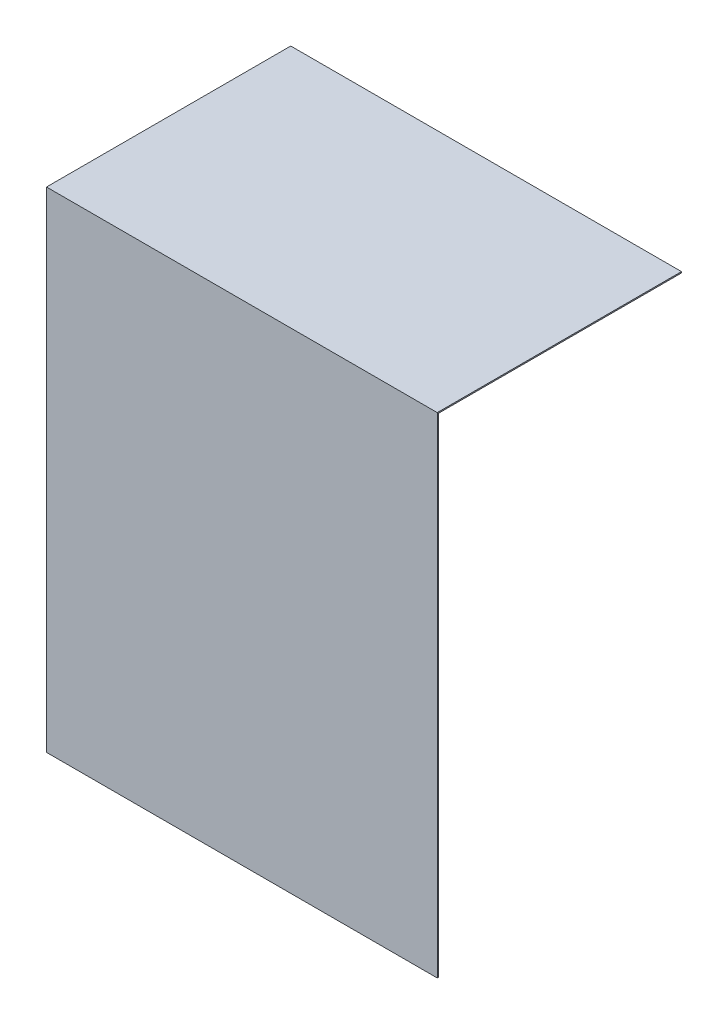
ISO-10303-21;
HEADER;
FILE_DESCRIPTION(('STEP AP214'),'2;1');
FILE_NAME('part.step','',(''),(''),'','','');
FILE_SCHEMA(('AUTOMOTIVE_DESIGN { 1 0 10303 214 1 1 1 1 }'));
ENDSEC;
DATA;
#1=APPLICATION_CONTEXT('core data for automotive mechanical design processes');
#2=APPLICATION_PROTOCOL_DEFINITION('international standard','automotive_design',2000,#1);
#3=PRODUCT_CONTEXT('',#1,'mechanical');
#4=PRODUCT('Part','Part','',(#3));
#5=PRODUCT_RELATED_PRODUCT_CATEGORY('part','',(#4));
#6=PRODUCT_DEFINITION_FORMATION('','',#4);
#7=PRODUCT_DEFINITION_CONTEXT('part definition',#1,'design');
#8=PRODUCT_DEFINITION('design','',#6,#7);
#9=PRODUCT_DEFINITION_SHAPE('','',#8);
#10=(LENGTH_UNIT() NAMED_UNIT(*) SI_UNIT(.MILLI.,.METRE.));
#11=(NAMED_UNIT(*) PLANE_ANGLE_UNIT() SI_UNIT($,.RADIAN.));
#12=(NAMED_UNIT(*) SI_UNIT($,.STERADIAN.) SOLID_ANGLE_UNIT());
#13=UNCERTAINTY_MEASURE_WITH_UNIT(LENGTH_MEASURE(1.E-05),#10,'distance_accuracy_value','');
#14=(GEOMETRIC_REPRESENTATION_CONTEXT(3) GLOBAL_UNCERTAINTY_ASSIGNED_CONTEXT((#13)) GLOBAL_UNIT_ASSIGNED_CONTEXT((#10,
#11,#12)) REPRESENTATION_CONTEXT('',''));
#15=CARTESIAN_POINT('',(0.,0.,0.));
#16=DIRECTION('',(0.,0.,1.));
#17=DIRECTION('',(1.,0.,0.));
#18=AXIS2_PLACEMENT_3D('',#15,#16,#17);
#19=CARTESIAN_POINT('',(23.8051990917926,5.3809677039066,-0.00109891080534995));
#20=CARTESIAN_POINT('',(23.8051990917926,5.38096770380169,0.000101089194650328));
#21=CARTESIAN_POINT('',(24.1891990917925,5.38096769932745,-0.00109891080535035));
#22=CARTESIAN_POINT('',(24.1891990917925,5.38096769922254,0.000101089194649927));
#23=(BOUNDED_SURFACE() B_SPLINE_SURFACE(1,1,((#19,#20),(#21,#22)),.UNSPECIFIED.,.F.,.F.,
.F.) B_SPLINE_SURFACE_WITH_KNOTS((2,2),(2,2),(-3.19999999999904E-05,0.000351999999999894),
(-1.10000000000016E-06,1.00000000000124E-07),
.UNSPECIFIED.) GEOMETRIC_REPRESENTATION_ITEM() RATIONAL_B_SPLINE_SURFACE(((1.,1.),(1.,1.))) REPRESENTATION_ITEM('') SURFACE());
#24=CARTESIAN_POINT('',(24.1571990917925,5.38096769961288,1.08919464983717E-06));
#25=CARTESIAN_POINT('',(23.8371990917926,5.38096770342884,1.08919465017077E-06));
#26=(BOUNDED_CURVE() B_SPLINE_CURVE(1,(#24,#25),.UNSPECIFIED.,.F.,
.F.) B_SPLINE_CURVE_WITH_KNOTS((2,2),(0.,0.000319999999999903),
.UNSPECIFIED.) CURVE() GEOMETRIC_REPRESENTATION_ITEM() RATIONAL_B_SPLINE_CURVE((1.,1.)) REPRESENTATION_ITEM(''));
#27=CARTESIAN_POINT('',(24.1571990917925,5.38096769961288,1.08919464983717E-06));
#28=VERTEX_POINT('',#27);
#29=CARTESIAN_POINT('',(23.8371990917926,5.38096770342886,1.08919465027085E-06));
#30=VERTEX_POINT('',#29);
#31=EDGE_CURVE('E76',#28,#30,#26,.T.);
#32=CARTESIAN_POINT('',(23.8371990917926,5.38096770342886,1.08919465027085E-06));
#33=CARTESIAN_POINT('',(23.8371990917926,5.38096770351628,-0.000998910805349862));
#34=(BOUNDED_CURVE() B_SPLINE_CURVE(1,(#32,#33),.UNSPECIFIED.,.F.,
.F.) B_SPLINE_CURVE_WITH_KNOTS((2,2),(0.,1.00000000000013E-06),
.UNSPECIFIED.) CURVE() GEOMETRIC_REPRESENTATION_ITEM() RATIONAL_B_SPLINE_CURVE((1.,1.)) REPRESENTATION_ITEM(''));
#35=CARTESIAN_POINT('',(23.8371990917926,5.38096770351629,-0.000998910805349862));
#36=VERTEX_POINT('',#35);
#37=EDGE_CURVE('E32',#30,#36,#34,.T.);
#38=CARTESIAN_POINT('',(24.1571990917925,5.38096769970031,-0.000998910805350296));
#39=CARTESIAN_POINT('',(23.8371990917926,5.38096770351627,-0.000998910805349962));
#40=(BOUNDED_CURVE() B_SPLINE_CURVE(1,(#38,#39),.UNSPECIFIED.,.F.,
.F.) B_SPLINE_CURVE_WITH_KNOTS((2,2),(0.,0.000319999999999903),
.UNSPECIFIED.) CURVE() GEOMETRIC_REPRESENTATION_ITEM() RATIONAL_B_SPLINE_CURVE((1.,1.)) REPRESENTATION_ITEM(''));
#41=CARTESIAN_POINT('',(24.1571990917925,5.38096769970031,-0.000998910805350296));
#42=VERTEX_POINT('',#41);
#43=EDGE_CURVE('E127',#42,#36,#40,.T.);
#44=CARTESIAN_POINT('',(24.1571990917925,5.38096769961288,1.08919464983717E-06));
#45=CARTESIAN_POINT('',(24.1571990917925,5.3809676997003,-0.000998910805350296));
#46=(BOUNDED_CURVE() B_SPLINE_CURVE(1,(#44,#45),.UNSPECIFIED.,.F.,
.F.) B_SPLINE_CURVE_WITH_KNOTS((2,2),(0.,1.00000000000013E-06),
.UNSPECIFIED.) CURVE() GEOMETRIC_REPRESENTATION_ITEM() RATIONAL_B_SPLINE_CURVE((1.,1.)) REPRESENTATION_ITEM(''));
#47=EDGE_CURVE('E11',#28,#42,#46,.T.);
#48=ORIENTED_EDGE('',*,*,#31,.T.);
#49=ORIENTED_EDGE('',*,*,#37,.T.);
#50=ORIENTED_EDGE('',*,*,#43,.F.);
#51=ORIENTED_EDGE('',*,*,#47,.F.);
#52=EDGE_LOOP('',(#48,#49,#50,#51));
#53=FACE_BOUND('',#52,.T.);
#54=ADVANCED_FACE('F17',(#53),#23,.T.);
#55=CARTESIAN_POINT('',(24.1571990913144,5.34086771884588,-0.219998914311001));
#56=CARTESIAN_POINT('',(24.1571990913144,5.34086769786442,0.0200010856889981));
#57=CARTESIAN_POINT('',(24.1571990970527,5.8220677188459,-0.219998872243182));
#58=CARTESIAN_POINT('',(24.1571990970527,5.82206769786444,0.0200011277568177));
#59=(BOUNDED_SURFACE() B_SPLINE_SURFACE(1,1,((#55,#56),(#57,#58)),.UNSPECIFIED.,.F.,.F.,
.F.) B_SPLINE_SURFACE_WITH_KNOTS((2,2),(2,2),(-4.01000000000053E-05,0.000441100000000014),
(-0.00022,2.E-05),.UNSPECIFIED.) GEOMETRIC_REPRESENTATION_ITEM() RATIONAL_B_SPLINE_SURFACE(((1.,
1.),(1.,1.))) REPRESENTATION_ITEM('') SURFACE());
#60=CARTESIAN_POINT('',(24.1571990965626,5.78096769970032,-0.000998875836256746));
#61=CARTESIAN_POINT('',(24.1571990917926,5.38096769970031,-0.000998910805350322));
#62=(BOUNDED_CURVE() B_SPLINE_CURVE(1,(#60,#61),.UNSPECIFIED.,.F.,
.F.) B_SPLINE_CURVE_WITH_KNOTS((2,2),(9.9999999999989E-07,0.00040100000000001),
.UNSPECIFIED.) CURVE() GEOMETRIC_REPRESENTATION_ITEM() RATIONAL_B_SPLINE_CURVE((1.,1.)) REPRESENTATION_ITEM(''));
#63=CARTESIAN_POINT('',(24.1571990965626,5.78096769970032,-0.000998875836256703));
#64=VERTEX_POINT('',#63);
#65=EDGE_CURVE('E80',#64,#42,#62,.T.);
#66=CARTESIAN_POINT('',(24.1571990965626,5.78096769970031,-0.000998875836256703));
#67=CARTESIAN_POINT('',(24.1571990965626,5.78096771709744,-0.199998875836256));
#68=(BOUNDED_CURVE() B_SPLINE_CURVE(1,(#66,#67),.UNSPECIFIED.,.F.,
.F.) B_SPLINE_CURVE_WITH_KNOTS((2,2),(1.00000000000013E-06,0.0002),
.UNSPECIFIED.) CURVE() GEOMETRIC_REPRESENTATION_ITEM() RATIONAL_B_SPLINE_CURVE((1.,1.)) REPRESENTATION_ITEM(''));
#69=CARTESIAN_POINT('',(24.1571990965626,5.78096771709744,-0.199998875836256));
#70=VERTEX_POINT('',#69);
#71=EDGE_CURVE('E23',#64,#70,#68,.T.);
#72=CARTESIAN_POINT('',(24.1571990965626,5.78096771709744,-0.199998875836256));
#73=CARTESIAN_POINT('',(24.1571990965745,5.78196771709744,-0.199998875748833));
#74=(BOUNDED_CURVE() B_SPLINE_CURVE(1,(#72,#73),.UNSPECIFIED.,.F.,
.F.) B_SPLINE_CURVE_WITH_KNOTS((2,2),(-9.9999999999989E-07,0.),
.UNSPECIFIED.) CURVE() GEOMETRIC_REPRESENTATION_ITEM() RATIONAL_B_SPLINE_CURVE((1.,1.)) REPRESENTATION_ITEM(''));
#75=CARTESIAN_POINT('',(24.1571990965745,5.78196771709744,-0.199998875748833));
#76=VERTEX_POINT('',#75);
#77=EDGE_CURVE('E86',#70,#76,#74,.T.);
#78=CARTESIAN_POINT('',(24.1571990965745,5.78196769961289,1.1242511661208E-06));
#79=CARTESIAN_POINT('',(24.1571990965745,5.78196771709744,-0.199998875748833));
#80=(BOUNDED_CURVE() B_SPLINE_CURVE(1,(#78,#79),.UNSPECIFIED.,.F.,
.F.) B_SPLINE_CURVE_WITH_KNOTS((2,2),(0.,0.0002),
.UNSPECIFIED.) CURVE() GEOMETRIC_REPRESENTATION_ITEM() RATIONAL_B_SPLINE_CURVE((1.,1.)) REPRESENTATION_ITEM(''));
#81=CARTESIAN_POINT('',(24.1571990965745,5.78196769961289,1.1242511661208E-06));
#82=VERTEX_POINT('',#81);
#83=EDGE_CURVE('E83',#82,#76,#80,.T.);
#84=CARTESIAN_POINT('',(24.1571990965745,5.78196769961289,1.1242511661208E-06));
#85=CARTESIAN_POINT('',(24.1571990917926,5.38096769961288,1.08919464981049E-06));
#86=(BOUNDED_CURVE() B_SPLINE_CURVE(1,(#84,#85),.UNSPECIFIED.,.F.,
.F.) B_SPLINE_CURVE_WITH_KNOTS((2,2),(0.,0.00040100000000001),
.UNSPECIFIED.) CURVE() GEOMETRIC_REPRESENTATION_ITEM() RATIONAL_B_SPLINE_CURVE((1.,1.)) REPRESENTATION_ITEM(''));
#87=EDGE_CURVE('E70',#82,#28,#86,.T.);
#88=ORIENTED_EDGE('',*,*,#47,.T.);
#89=ORIENTED_EDGE('',*,*,#65,.F.);
#90=ORIENTED_EDGE('',*,*,#71,.T.);
#91=ORIENTED_EDGE('',*,*,#77,.T.);
#92=ORIENTED_EDGE('',*,*,#83,.F.);
#93=ORIENTED_EDGE('',*,*,#87,.T.);
#94=EDGE_LOOP('',(#88,#89,#90,#91,#92,#93));
#95=FACE_BOUND('',#94,.T.);
#96=ADVANCED_FACE('F84',(#95),#59,.T.);
#97=CARTESIAN_POINT('',(23.8371990970527,5.82206772266187,-0.219998872243182));
#98=CARTESIAN_POINT('',(23.8371990970527,5.82206770168041,0.0200011277568182));
#99=CARTESIAN_POINT('',(23.8371990913144,5.34086772266186,-0.219998914311001));
#100=CARTESIAN_POINT('',(23.8371990913144,5.3408677016804,0.0200010856889986));
#101=(BOUNDED_SURFACE() B_SPLINE_SURFACE(1,1,((#97,#98),(#99,#100)),.UNSPECIFIED.,.F.,.F.,
.F.) B_SPLINE_SURFACE_WITH_KNOTS((2,2),(2,2),(-4.01000000000015E-05,0.000441100000000006),
(-0.00022,2.E-05),.UNSPECIFIED.) GEOMETRIC_REPRESENTATION_ITEM() RATIONAL_B_SPLINE_SURFACE(((1.,
1.),(1.,1.))) REPRESENTATION_ITEM('') SURFACE());
#102=CARTESIAN_POINT('',(23.8371990917926,5.38096770342886,1.08919465027085E-06));
#103=CARTESIAN_POINT('',(23.8371990965745,5.78196770342884,1.12425116658115E-06));
#104=(BOUNDED_CURVE() B_SPLINE_CURVE(1,(#102,#103),.UNSPECIFIED.,.F.,
.F.) B_SPLINE_CURVE_WITH_KNOTS((2,2),(0.,0.00040099999999998),
.UNSPECIFIED.) CURVE() GEOMETRIC_REPRESENTATION_ITEM() RATIONAL_B_SPLINE_CURVE((1.,1.)) REPRESENTATION_ITEM(''));
#105=CARTESIAN_POINT('',(23.8371990965744,5.78196770342884,1.12425116655448E-06));
#106=VERTEX_POINT('',#105);
#107=EDGE_CURVE('E79',#30,#106,#104,.T.);
#108=CARTESIAN_POINT('',(23.8371990965744,5.78196770342884,1.12425116655448E-06));
#109=CARTESIAN_POINT('',(23.8371990965744,5.78196772091339,-0.199998875748833));
#110=(BOUNDED_CURVE() B_SPLINE_CURVE(1,(#108,#109),.UNSPECIFIED.,.F.,
.F.) B_SPLINE_CURVE_WITH_KNOTS((2,2),(0.,0.0002),
.UNSPECIFIED.) CURVE() GEOMETRIC_REPRESENTATION_ITEM() RATIONAL_B_SPLINE_CURVE((1.,1.)) REPRESENTATION_ITEM(''));
#111=CARTESIAN_POINT('',(23.8371990965744,5.78196772091341,-0.199998875748833));
#112=VERTEX_POINT('',#111);
#113=EDGE_CURVE('E91',#106,#112,#110,.T.);
#114=CARTESIAN_POINT('',(23.8371990965625,5.78096772091341,-0.199998875836256));
#115=CARTESIAN_POINT('',(23.8371990965744,5.78196772091341,-0.199998875748833));
#116=(BOUNDED_CURVE() B_SPLINE_CURVE(1,(#114,#115),.UNSPECIFIED.,.F.,
.F.) B_SPLINE_CURVE_WITH_KNOTS((2,2),(0.,9.9999999999989E-07),
.UNSPECIFIED.) CURVE() GEOMETRIC_REPRESENTATION_ITEM() RATIONAL_B_SPLINE_CURVE((1.,1.)) REPRESENTATION_ITEM(''));
#117=CARTESIAN_POINT('',(23.8371990965625,5.78096772091341,-0.199998875836256));
#118=VERTEX_POINT('',#117);
#119=EDGE_CURVE('E175',#118,#112,#116,.T.);
#120=CARTESIAN_POINT('',(23.8371990965625,5.78096772091342,-0.199998875836256));
#121=CARTESIAN_POINT('',(23.8371990965625,5.78096770351629,-0.000998875836256269));
#122=(BOUNDED_CURVE() B_SPLINE_CURVE(1,(#120,#121),.UNSPECIFIED.,.F.,
.F.) B_SPLINE_CURVE_WITH_KNOTS((2,2),(-0.0002,-1.00000000000013E-06),
.UNSPECIFIED.) CURVE() GEOMETRIC_REPRESENTATION_ITEM() RATIONAL_B_SPLINE_CURVE((1.,1.)) REPRESENTATION_ITEM(''));
#123=CARTESIAN_POINT('',(23.8371990965625,5.78096770351627,-0.000998875836256269));
#124=VERTEX_POINT('',#123);
#125=EDGE_CURVE('E108',#118,#124,#122,.T.);
#126=CARTESIAN_POINT('',(23.8371990917926,5.38096770351629,-0.000998910805349862));
#127=CARTESIAN_POINT('',(23.8371990965626,5.78096770351627,-0.000998875836256286));
#128=(BOUNDED_CURVE() B_SPLINE_CURVE(1,(#126,#127),.UNSPECIFIED.,.F.,
.F.) B_SPLINE_CURVE_WITH_KNOTS((2,2),(0.,0.00039999999999998),
.UNSPECIFIED.) CURVE() GEOMETRIC_REPRESENTATION_ITEM() RATIONAL_B_SPLINE_CURVE((1.,1.)) REPRESENTATION_ITEM(''));
#129=EDGE_CURVE('E135',#36,#124,#128,.T.);
#130=ORIENTED_EDGE('',*,*,#107,.T.);
#131=ORIENTED_EDGE('',*,*,#113,.T.);
#132=ORIENTED_EDGE('',*,*,#119,.F.);
#133=ORIENTED_EDGE('',*,*,#125,.T.);
#134=ORIENTED_EDGE('',*,*,#129,.F.);
#135=ORIENTED_EDGE('',*,*,#37,.F.);
#136=EDGE_LOOP('',(#130,#131,#132,#133,#134,#135));
#137=FACE_BOUND('',#136,.T.);
#138=ADVANCED_FACE('F19',(#137),#101,.T.);
#139=CARTESIAN_POINT('',(24.1891990913144,5.34086769923128,1.0856889981461E-06));
#140=CARTESIAN_POINT('',(23.8051990913143,5.34086770381044,1.08568899854643E-06));
#141=CARTESIAN_POINT('',(24.1891990970527,5.82206769923129,1.12775681771847E-06));
#142=CARTESIAN_POINT('',(23.8051990970526,5.82206770381045,1.12775681811879E-06));
#143=(BOUNDED_SURFACE() B_SPLINE_SURFACE(1,1,((#139,#140),(#141,#142)),.UNSPECIFIED.,.F.,.F.,
.F.) B_SPLINE_SURFACE_WITH_KNOTS((2,2),(2,2),(-0.000441100000000013,4.01000000000012E-05),
(-3.20000000000122E-05,0.000352000000000108),
.UNSPECIFIED.) GEOMETRIC_REPRESENTATION_ITEM() RATIONAL_B_SPLINE_SURFACE(((1.,1.),(1.,1.))) REPRESENTATION_ITEM('') SURFACE());
#144=CARTESIAN_POINT('',(23.8371990965744,5.78196770342884,1.12425116655448E-06));
#145=CARTESIAN_POINT('',(24.1571990965745,5.78196769961288,1.12425116622088E-06));
#146=(BOUNDED_CURVE() B_SPLINE_CURVE(1,(#144,#145),.UNSPECIFIED.,.F.,
.F.) B_SPLINE_CURVE_WITH_KNOTS((2,2),(0.,0.000320000000000098),
.UNSPECIFIED.) CURVE() GEOMETRIC_REPRESENTATION_ITEM() RATIONAL_B_SPLINE_CURVE((1.,1.)) REPRESENTATION_ITEM(''));
#147=EDGE_CURVE('E75',#106,#82,#146,.T.);
#148=ORIENTED_EDGE('',*,*,#87,.F.);
#149=ORIENTED_EDGE('',*,*,#147,.F.);
#150=ORIENTED_EDGE('',*,*,#107,.F.);
#151=ORIENTED_EDGE('',*,*,#31,.F.);
#152=EDGE_LOOP('',(#148,#149,#150,#151));
#153=FACE_BOUND('',#152,.T.);
#154=ADVANCED_FACE('F72',(#153),#143,.T.);
#155=CARTESIAN_POINT('',(24.1891990970396,5.82096769931873,-0.000998872339347422));
#156=CARTESIAN_POINT('',(23.8051990970395,5.82096770389788,-0.000998872339347021));
#157=CARTESIAN_POINT('',(24.1891990913157,5.34096769931871,-0.000998914302259713));
#158=CARTESIAN_POINT('',(23.8051990913155,5.34096770389787,-0.000998914302259313));
#159=(BOUNDED_SURFACE() B_SPLINE_SURFACE(1,1,((#155,#156),(#157,#158)),.UNSPECIFIED.,.F.,.F.,
.F.) B_SPLINE_SURFACE_WITH_KNOTS((2,2),(2,2),(-0.000441000000000014,3.90000000000018E-05),
(-3.20000000000333E-05,0.000352000000000087),
.UNSPECIFIED.) GEOMETRIC_REPRESENTATION_ITEM() RATIONAL_B_SPLINE_SURFACE(((1.,1.),(1.,1.))) REPRESENTATION_ITEM('') SURFACE());
#160=CARTESIAN_POINT('',(23.8371990965625,5.78096770351628,-0.000998875836256369));
#161=CARTESIAN_POINT('',(24.1571990965626,5.78096769970032,-0.000998875836256703));
#162=(BOUNDED_CURVE() B_SPLINE_CURVE(1,(#160,#161),.UNSPECIFIED.,.F.,
.F.) B_SPLINE_CURVE_WITH_KNOTS((2,2),(-0.000320000000000098,0.),
.UNSPECIFIED.) CURVE() GEOMETRIC_REPRESENTATION_ITEM() RATIONAL_B_SPLINE_CURVE((1.,1.)) REPRESENTATION_ITEM(''));
#163=EDGE_CURVE('E118',#124,#64,#162,.T.);
#164=ORIENTED_EDGE('',*,*,#43,.T.);
#165=ORIENTED_EDGE('',*,*,#129,.T.);
#166=ORIENTED_EDGE('',*,*,#163,.T.);
#167=ORIENTED_EDGE('',*,*,#65,.T.);
#168=EDGE_LOOP('',(#164,#165,#166,#167));
#169=FACE_BOUND('',#168,.T.);
#170=ADVANCED_FACE('F211',(#169),#159,.T.);
#171=CARTESIAN_POINT('',(24.1891990965626,5.78096771845555,-0.219898875836256));
#172=CARTESIAN_POINT('',(23.8051990965625,5.78096772303471,-0.219898875836256));
#173=CARTESIAN_POINT('',(24.1891990965626,5.780967697579,0.0189011241637433));
#174=CARTESIAN_POINT('',(23.8051990965625,5.78096770215816,0.0189011241637438));
#175=(BOUNDED_SURFACE() B_SPLINE_SURFACE(1,1,((#171,#172),(#173,#174)),.UNSPECIFIED.,.F.,.F.,
.F.) B_SPLINE_SURFACE_WITH_KNOTS((2,2),(2,2),(-0.0002199,1.89E-05),(-3.20000000000098E-05,
0.000352000000000108),
.UNSPECIFIED.) GEOMETRIC_REPRESENTATION_ITEM() RATIONAL_B_SPLINE_SURFACE(((1.,1.),(1.,1.))) REPRESENTATION_ITEM('') SURFACE());
#176=CARTESIAN_POINT('',(24.1571990965626,5.78096771709744,-0.199998875836256));
#177=CARTESIAN_POINT('',(23.8371990965625,5.7809677209134,-0.199998875836256));
#178=(BOUNDED_CURVE() B_SPLINE_CURVE(1,(#176,#177),.UNSPECIFIED.,.F.,
.F.) B_SPLINE_CURVE_WITH_KNOTS((2,2),(0.,0.000320000000000098),
.UNSPECIFIED.) CURVE() GEOMETRIC_REPRESENTATION_ITEM() RATIONAL_B_SPLINE_CURVE((1.,1.)) REPRESENTATION_ITEM(''));
#179=EDGE_CURVE('E166',#70,#118,#178,.T.);
#180=ORIENTED_EDGE('',*,*,#71,.F.);
#181=ORIENTED_EDGE('',*,*,#163,.F.);
#182=ORIENTED_EDGE('',*,*,#125,.F.);
#183=ORIENTED_EDGE('',*,*,#179,.F.);
#184=EDGE_LOOP('',(#180,#181,#182,#183));
#185=FACE_BOUND('',#184,.T.);
#186=ADVANCED_FACE('F221',(#185),#175,.T.);
#187=CARTESIAN_POINT('',(24.1891990965745,5.78196771846428,-0.219998875748833));
#188=CARTESIAN_POINT('',(24.1891990965745,5.78196769748283,0.0200011242511662));
#189=CARTESIAN_POINT('',(23.8051990965744,5.78196772304344,-0.219998875748833));
#190=CARTESIAN_POINT('',(23.8051990965744,5.78196770206198,0.0200011242511665));
#191=(BOUNDED_SURFACE() B_SPLINE_SURFACE(1,1,((#187,#188),(#189,#190)),.UNSPECIFIED.,.F.,.F.,
.F.) B_SPLINE_SURFACE_WITH_KNOTS((2,2),(2,2),(-3.20000000000098E-05,0.000352000000000108),
(-0.00022,2.E-05),.UNSPECIFIED.) GEOMETRIC_REPRESENTATION_ITEM() RATIONAL_B_SPLINE_SURFACE(((1.,
1.),(1.,1.))) REPRESENTATION_ITEM('') SURFACE());
#192=CARTESIAN_POINT('',(24.1571990965745,5.78196771709744,-0.199998875748833));
#193=CARTESIAN_POINT('',(23.8371990965744,5.7819677209134,-0.199998875748833));
#194=(BOUNDED_CURVE() B_SPLINE_CURVE(1,(#192,#193),.UNSPECIFIED.,.F.,
.F.) B_SPLINE_CURVE_WITH_KNOTS((2,2),(0.,0.000320000000000098),
.UNSPECIFIED.) CURVE() GEOMETRIC_REPRESENTATION_ITEM() RATIONAL_B_SPLINE_CURVE((1.,1.)) REPRESENTATION_ITEM(''));
#195=EDGE_CURVE('E102',#76,#112,#194,.T.);
#196=ORIENTED_EDGE('',*,*,#147,.T.);
#197=ORIENTED_EDGE('',*,*,#83,.T.);
#198=ORIENTED_EDGE('',*,*,#195,.T.);
#199=ORIENTED_EDGE('',*,*,#113,.F.);
#200=EDGE_LOOP('',(#196,#197,#198,#199));
#201=FACE_BOUND('',#200,.T.);
#202=ADVANCED_FACE('F94',(#201),#191,.T.);
#203=CARTESIAN_POINT('',(23.8051990965756,5.78206772129501,-0.199998875740091));
#204=CARTESIAN_POINT('',(23.8051990965613,5.780867721295,-0.199998875844998));
#205=CARTESIAN_POINT('',(24.1891990965757,5.78206771671585,-0.199998875740091));
#206=CARTESIAN_POINT('',(24.1891990965614,5.78086771671584,-0.199998875844998));
#207=(BOUNDED_SURFACE() B_SPLINE_SURFACE(1,1,((#203,#204),(#205,#206)),.UNSPECIFIED.,.F.,.F.,
.F.) B_SPLINE_SURFACE_WITH_KNOTS((2,2),(2,2),(-3.20000000000122E-05,0.000352000000000134),
(-1.10000000000878E-06,1.0000000000128E-07),
.UNSPECIFIED.) GEOMETRIC_REPRESENTATION_ITEM() RATIONAL_B_SPLINE_SURFACE(((1.,1.),(1.,1.))) REPRESENTATION_ITEM('') SURFACE());
#208=ORIENTED_EDGE('',*,*,#179,.T.);
#209=ORIENTED_EDGE('',*,*,#119,.T.);
#210=ORIENTED_EDGE('',*,*,#195,.F.);
#211=ORIENTED_EDGE('',*,*,#77,.F.);
#212=EDGE_LOOP('',(#208,#209,#210,#211));
#213=FACE_BOUND('',#212,.T.);
#214=ADVANCED_FACE('F294',(#213),#207,.T.);
#215=CLOSED_SHELL('',(#54,#96,#138,#154,#170,#186,#202,#214));
#216=MANIFOLD_SOLID_BREP('B1',#215);
#217=ADVANCED_BREP_SHAPE_REPRESENTATION('',(#18,#216),#14);
#218=SHAPE_DEFINITION_REPRESENTATION(#9,#217);
ENDSEC;
END-ISO-10303-21;
